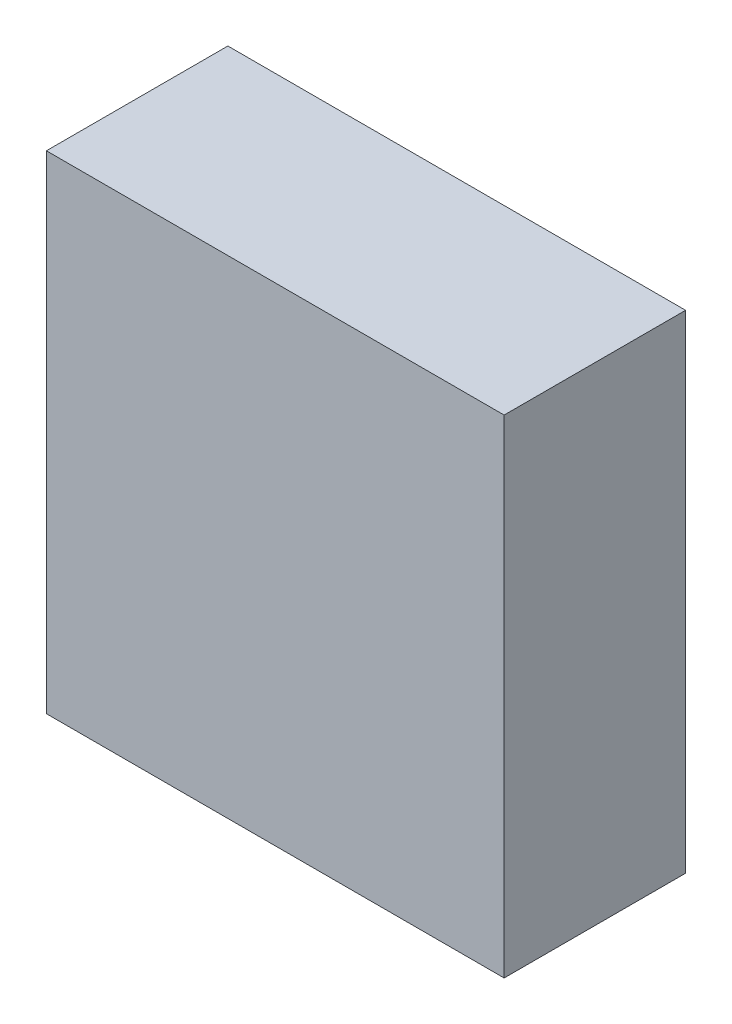
ISO-10303-21;
HEADER;
FILE_DESCRIPTION(('STEP AP214'),'2;1');
FILE_NAME('part.step','',(''),(''),'','','');
FILE_SCHEMA(('AUTOMOTIVE_DESIGN { 1 0 10303 214 1 1 1 1 }'));
ENDSEC;
DATA;
#1=APPLICATION_CONTEXT('core data for automotive mechanical design processes');
#2=APPLICATION_PROTOCOL_DEFINITION('international standard','automotive_design',2000,#1);
#3=PRODUCT_CONTEXT('',#1,'mechanical');
#4=PRODUCT('Part','Part','',(#3));
#5=PRODUCT_RELATED_PRODUCT_CATEGORY('part','',(#4));
#6=PRODUCT_DEFINITION_FORMATION('','',#4);
#7=PRODUCT_DEFINITION_CONTEXT('part definition',#1,'design');
#8=PRODUCT_DEFINITION('design','',#6,#7);
#9=PRODUCT_DEFINITION_SHAPE('','',#8);
#10=(LENGTH_UNIT() NAMED_UNIT(*) SI_UNIT(.MILLI.,.METRE.));
#11=(NAMED_UNIT(*) PLANE_ANGLE_UNIT() SI_UNIT($,.RADIAN.));
#12=(NAMED_UNIT(*) SI_UNIT($,.STERADIAN.) SOLID_ANGLE_UNIT());
#13=UNCERTAINTY_MEASURE_WITH_UNIT(LENGTH_MEASURE(1.E-05),#10,'distance_accuracy_value','');
#14=(GEOMETRIC_REPRESENTATION_CONTEXT(3) GLOBAL_UNCERTAINTY_ASSIGNED_CONTEXT((#13)) GLOBAL_UNIT_ASSIGNED_CONTEXT((#10,
#11,#12)) REPRESENTATION_CONTEXT('',''));
#15=CARTESIAN_POINT('',(0.,0.,0.));
#16=DIRECTION('',(0.,0.,1.));
#17=DIRECTION('',(1.,0.,0.));
#18=AXIS2_PLACEMENT_3D('',#15,#16,#17);
#19=CARTESIAN_POINT('',(26.28140032,6.55139868,0.));
#20=DIRECTION('',(0.,-1.,0.));
#21=DIRECTION('',(0.,0.,-1.));
#22=AXIS2_PLACEMENT_3D('',#19,#20,#21);
#23=PLANE('',#22);
#24=DIRECTION('',(-1.,0.,0.));
#25=VECTOR('',#24,1.);
#26=CARTESIAN_POINT('',(26.28140032,6.55139868,0.));
#27=LINE('',#26,#25);
#28=CARTESIAN_POINT('',(26.18140132,6.55139868,0.));
#29=VERTEX_POINT('',#28);
#30=CARTESIAN_POINT('',(9.2814013,6.55139868,0.));
#31=VERTEX_POINT('',#30);
#32=EDGE_CURVE('E90',#29,#31,#27,.T.);
#33=ORIENTED_EDGE('',*,*,#32,.F.);
#34=DIRECTION('',(0.,0.,1.));
#35=VECTOR('',#34,1.);
#36=CARTESIAN_POINT('',(26.18140132,6.55139868,0.));
#37=LINE('',#36,#35);
#38=CARTESIAN_POINT('',(26.18140132,6.55139868,6.7));
#39=VERTEX_POINT('',#38);
#40=EDGE_CURVE('E11',#29,#39,#37,.T.);
#41=ORIENTED_EDGE('',*,*,#40,.T.);
#42=DIRECTION('',(-1.,0.,0.));
#43=VECTOR('',#42,1.);
#44=CARTESIAN_POINT('',(26.28140032,6.55139868,6.7));
#45=LINE('',#44,#43);
#46=CARTESIAN_POINT('',(9.2814013,6.55139868,6.7));
#47=VERTEX_POINT('',#46);
#48=EDGE_CURVE('E84',#39,#47,#45,.T.);
#49=ORIENTED_EDGE('',*,*,#48,.T.);
#50=DIRECTION('',(0.,0.,1.));
#51=VECTOR('',#50,1.);
#52=CARTESIAN_POINT('',(9.2814013,6.55139868,0.));
#53=LINE('',#52,#51);
#54=EDGE_CURVE('E70',#31,#47,#53,.T.);
#55=ORIENTED_EDGE('',*,*,#54,.F.);
#56=EDGE_LOOP('',(#33,#41,#49,#55));
#57=FACE_BOUND('',#56,.T.);
#58=ADVANCED_FACE('F17',(#57),#23,.T.);
#59=CARTESIAN_POINT('',(26.18140132,24.5513987,0.));
#60=DIRECTION('',(1.,0.,0.));
#61=DIRECTION('',(0.,1.,0.));
#62=AXIS2_PLACEMENT_3D('',#59,#60,#61);
#63=PLANE('',#62);
#64=DIRECTION('',(0.,-1.,0.));
#65=VECTOR('',#64,1.);
#66=CARTESIAN_POINT('',(26.18140132,24.5513987,0.));
#67=LINE('',#66,#65);
#68=CARTESIAN_POINT('',(26.18140132,24.5513987,0.));
#69=VERTEX_POINT('',#68);
#70=EDGE_CURVE('E98',#69,#29,#67,.T.);
#71=ORIENTED_EDGE('',*,*,#70,.F.);
#72=DIRECTION('',(0.,0.,1.));
#73=VECTOR('',#72,1.);
#74=CARTESIAN_POINT('',(26.18140132,24.5513987,0.));
#75=LINE('',#74,#73);
#76=CARTESIAN_POINT('',(26.18140132,24.5513987,6.7));
#77=VERTEX_POINT('',#76);
#78=EDGE_CURVE('E27',#69,#77,#75,.T.);
#79=ORIENTED_EDGE('',*,*,#78,.T.);
#80=DIRECTION('',(0.,-1.,0.));
#81=VECTOR('',#80,1.);
#82=CARTESIAN_POINT('',(26.18140132,24.5513987,6.7));
#83=LINE('',#82,#81);
#84=EDGE_CURVE('E89',#77,#39,#83,.T.);
#85=ORIENTED_EDGE('',*,*,#84,.T.);
#86=ORIENTED_EDGE('',*,*,#40,.F.);
#87=EDGE_LOOP('',(#71,#79,#85,#86));
#88=FACE_BOUND('',#87,.T.);
#89=ADVANCED_FACE('F131',(#88),#63,.T.);
#90=CARTESIAN_POINT('',(9.2814013,24.5513987,0.));
#91=DIRECTION('',(0.,1.,0.));
#92=DIRECTION('',(1.,0.,0.));
#93=AXIS2_PLACEMENT_3D('',#90,#91,#92);
#94=PLANE('',#93);
#95=DIRECTION('',(1.,0.,0.));
#96=VECTOR('',#95,1.);
#97=CARTESIAN_POINT('',(9.2814013,24.5513987,0.));
#98=LINE('',#97,#96);
#99=CARTESIAN_POINT('',(9.2814013,24.5513987,0.));
#100=VERTEX_POINT('',#99);
#101=EDGE_CURVE('E107',#100,#69,#98,.T.);
#102=ORIENTED_EDGE('',*,*,#101,.F.);
#103=DIRECTION('',(0.,0.,1.));
#104=VECTOR('',#103,1.);
#105=CARTESIAN_POINT('',(9.2814013,24.5513987,0.));
#106=LINE('',#105,#104);
#107=CARTESIAN_POINT('',(9.2814013,24.5513987,6.7));
#108=VERTEX_POINT('',#107);
#109=EDGE_CURVE('E40',#100,#108,#106,.T.);
#110=ORIENTED_EDGE('',*,*,#109,.T.);
#111=DIRECTION('',(1.,0.,0.));
#112=VECTOR('',#111,1.);
#113=CARTESIAN_POINT('',(9.2814013,24.5513987,6.7));
#114=LINE('',#113,#112);
#115=EDGE_CURVE('E85',#108,#77,#114,.T.);
#116=ORIENTED_EDGE('',*,*,#115,.T.);
#117=ORIENTED_EDGE('',*,*,#78,.F.);
#118=EDGE_LOOP('',(#102,#110,#116,#117));
#119=FACE_BOUND('',#118,.T.);
#120=ADVANCED_FACE('F19',(#119),#94,.T.);
#121=CARTESIAN_POINT('',(9.2814013,7.55139968,0.));
#122=DIRECTION('',(-1.,0.,0.));
#123=DIRECTION('',(0.,0.,1.));
#124=AXIS2_PLACEMENT_3D('',#121,#122,#123);
#125=PLANE('',#124);
#126=DIRECTION('',(0.,1.,0.));
#127=VECTOR('',#126,1.);
#128=CARTESIAN_POINT('',(9.2814013,7.55139968,0.));
#129=LINE('',#128,#127);
#130=EDGE_CURVE('E76',#31,#100,#129,.T.);
#131=ORIENTED_EDGE('',*,*,#130,.F.);
#132=ORIENTED_EDGE('',*,*,#54,.T.);
#133=DIRECTION('',(0.,1.,0.));
#134=VECTOR('',#133,1.);
#135=CARTESIAN_POINT('',(9.2814013,7.55139968,6.7));
#136=LINE('',#135,#134);
#137=EDGE_CURVE('E73',#47,#108,#136,.T.);
#138=ORIENTED_EDGE('',*,*,#137,.T.);
#139=ORIENTED_EDGE('',*,*,#109,.F.);
#140=EDGE_LOOP('',(#131,#132,#138,#139));
#141=FACE_BOUND('',#140,.T.);
#142=ADVANCED_FACE('F72',(#141),#125,.T.);
#143=CARTESIAN_POINT('',(25.4,12.9999994,6.7));
#144=DIRECTION('',(0.,0.,1.));
#145=DIRECTION('',(1.,0.,0.));
#146=AXIS2_PLACEMENT_3D('',#143,#144,#145);
#147=PLANE('',#146);
#148=ORIENTED_EDGE('',*,*,#48,.F.);
#149=ORIENTED_EDGE('',*,*,#84,.F.);
#150=ORIENTED_EDGE('',*,*,#115,.F.);
#151=ORIENTED_EDGE('',*,*,#137,.F.);
#152=EDGE_LOOP('',(#148,#149,#150,#151));
#153=FACE_BOUND('',#152,.T.);
#154=ADVANCED_FACE('F82',(#153),#147,.T.);
#155=CARTESIAN_POINT('',(25.4,12.9999994,0.));
#156=DIRECTION('',(0.,0.,1.));
#157=DIRECTION('',(1.,0.,0.));
#158=AXIS2_PLACEMENT_3D('',#155,#156,#157);
#159=PLANE('',#158);
#160=ORIENTED_EDGE('',*,*,#130,.T.);
#161=ORIENTED_EDGE('',*,*,#101,.T.);
#162=ORIENTED_EDGE('',*,*,#70,.T.);
#163=ORIENTED_EDGE('',*,*,#32,.T.);
#164=EDGE_LOOP('',(#160,#161,#162,#163));
#165=FACE_BOUND('',#164,.T.);
#166=ADVANCED_FACE('F119',(#165),#159,.F.);
#167=CLOSED_SHELL('',(#58,#89,#120,#142,#154,#166));
#168=MANIFOLD_SOLID_BREP('B1',#167);
#169=ADVANCED_BREP_SHAPE_REPRESENTATION('',(#18,#168),#14);
#170=SHAPE_DEFINITION_REPRESENTATION(#9,#169);
ENDSEC;
END-ISO-10303-21;
